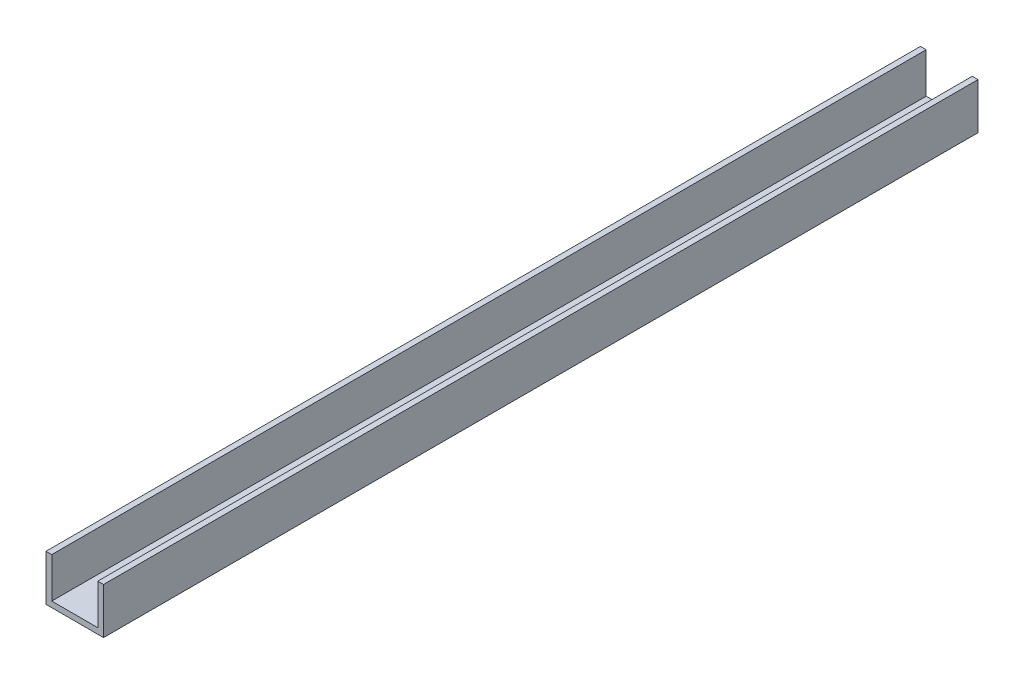
ISO-10303-21;
HEADER;
FILE_DESCRIPTION(('STEP AP214'),'2;1');
FILE_NAME('part.step','',(''),(''),'','','');
FILE_SCHEMA(('AUTOMOTIVE_DESIGN { 1 0 10303 214 1 1 1 1 }'));
ENDSEC;
DATA;
#1=APPLICATION_CONTEXT('core data for automotive mechanical design processes');
#2=APPLICATION_PROTOCOL_DEFINITION('international standard','automotive_design',2000,#1);
#3=PRODUCT_CONTEXT('',#1,'mechanical');
#4=PRODUCT('Part','Part','',(#3));
#5=PRODUCT_RELATED_PRODUCT_CATEGORY('part','',(#4));
#6=PRODUCT_DEFINITION_FORMATION('','',#4);
#7=PRODUCT_DEFINITION_CONTEXT('part definition',#1,'design');
#8=PRODUCT_DEFINITION('design','',#6,#7);
#9=PRODUCT_DEFINITION_SHAPE('','',#8);
#10=(LENGTH_UNIT() NAMED_UNIT(*) SI_UNIT(.MILLI.,.METRE.));
#11=(NAMED_UNIT(*) PLANE_ANGLE_UNIT() SI_UNIT($,.RADIAN.));
#12=(NAMED_UNIT(*) SI_UNIT($,.STERADIAN.) SOLID_ANGLE_UNIT());
#13=UNCERTAINTY_MEASURE_WITH_UNIT(LENGTH_MEASURE(1.E-05),#10,'distance_accuracy_value','');
#14=(GEOMETRIC_REPRESENTATION_CONTEXT(3) GLOBAL_UNCERTAINTY_ASSIGNED_CONTEXT((#13)) GLOBAL_UNIT_ASSIGNED_CONTEXT((#10,
#11,#12)) REPRESENTATION_CONTEXT('',''));
#15=CARTESIAN_POINT('',(0.,0.,0.));
#16=DIRECTION('',(0.,0.,1.));
#17=DIRECTION('',(1.,0.,0.));
#18=AXIS2_PLACEMENT_3D('',#15,#16,#17);
#19=CARTESIAN_POINT('',(0.,0.,241.3));
#20=DIRECTION('',(0.,1.,0.));
#21=DIRECTION('',(0.,0.,1.));
#22=AXIS2_PLACEMENT_3D('',#19,#20,#21);
#23=PLANE('',#22);
#24=DIRECTION('',(1.,0.,0.));
#25=VECTOR('',#24,1.);
#26=CARTESIAN_POINT('',(0.,0.,0.));
#27=LINE('',#26,#25);
#28=CARTESIAN_POINT('',(-7.9375,0.,0.));
#29=VERTEX_POINT('',#28);
#30=CARTESIAN_POINT('',(7.9375,0.,0.));
#31=VERTEX_POINT('',#30);
#32=EDGE_CURVE('E95',#29,#31,#27,.T.);
#33=ORIENTED_EDGE('',*,*,#32,.T.);
#34=DIRECTION('',(0.,0.,-1.));
#35=VECTOR('',#34,1.);
#36=CARTESIAN_POINT('',(7.9375,0.,241.3));
#37=LINE('',#36,#35);
#38=CARTESIAN_POINT('',(7.9375,0.,241.3));
#39=VERTEX_POINT('',#38);
#40=EDGE_CURVE('E11',#39,#31,#37,.T.);
#41=ORIENTED_EDGE('',*,*,#40,.F.);
#42=DIRECTION('',(1.,0.,0.));
#43=VECTOR('',#42,1.);
#44=CARTESIAN_POINT('',(-7.9375,0.,241.3));
#45=LINE('',#44,#43);
#46=CARTESIAN_POINT('',(-7.9375,0.,241.3));
#47=VERTEX_POINT('',#46);
#48=EDGE_CURVE('E101',#47,#39,#45,.T.);
#49=ORIENTED_EDGE('',*,*,#48,.F.);
#50=DIRECTION('',(0.,0.,-1.));
#51=VECTOR('',#50,1.);
#52=CARTESIAN_POINT('',(-7.9375,0.,241.3));
#53=LINE('',#52,#51);
#54=EDGE_CURVE('E135',#47,#29,#53,.T.);
#55=ORIENTED_EDGE('',*,*,#54,.T.);
#56=EDGE_LOOP('',(#33,#41,#49,#55));
#57=FACE_BOUND('',#56,.T.);
#58=ADVANCED_FACE('F43',(#57),#23,.F.);
#59=CARTESIAN_POINT('',(7.9375,0.,241.3));
#60=DIRECTION('',(-1.,0.,0.));
#61=DIRECTION('',(0.,0.,1.));
#62=AXIS2_PLACEMENT_3D('',#59,#60,#61);
#63=PLANE('',#62);
#64=DIRECTION('',(0.,1.,0.));
#65=VECTOR('',#64,1.);
#66=CARTESIAN_POINT('',(7.9375,0.,0.));
#67=LINE('',#66,#65);
#68=CARTESIAN_POINT('',(7.9375,12.7,0.));
#69=VERTEX_POINT('',#68);
#70=EDGE_CURVE('E140',#31,#69,#67,.T.);
#71=ORIENTED_EDGE('',*,*,#70,.T.);
#72=DIRECTION('',(0.,0.,-1.));
#73=VECTOR('',#72,1.);
#74=CARTESIAN_POINT('',(7.9375,12.7,241.3));
#75=LINE('',#74,#73);
#76=CARTESIAN_POINT('',(7.9375,12.7,241.3));
#77=VERTEX_POINT('',#76);
#78=EDGE_CURVE('E51',#77,#69,#75,.T.);
#79=ORIENTED_EDGE('',*,*,#78,.F.);
#80=DIRECTION('',(0.,1.,0.));
#81=VECTOR('',#80,1.);
#82=CARTESIAN_POINT('',(7.9375,0.,241.3));
#83=LINE('',#82,#81);
#84=EDGE_CURVE('E186',#39,#77,#83,.T.);
#85=ORIENTED_EDGE('',*,*,#84,.F.);
#86=ORIENTED_EDGE('',*,*,#40,.T.);
#87=EDGE_LOOP('',(#71,#79,#85,#86));
#88=FACE_BOUND('',#87,.T.);
#89=ADVANCED_FACE('F188',(#88),#63,.F.);
#90=CARTESIAN_POINT('',(7.9375,12.7,241.3));
#91=DIRECTION('',(0.,-1.,0.));
#92=DIRECTION('',(0.,0.,-1.));
#93=AXIS2_PLACEMENT_3D('',#90,#91,#92);
#94=PLANE('',#93);
#95=DIRECTION('',(-1.,0.,0.));
#96=VECTOR('',#95,1.);
#97=CARTESIAN_POINT('',(7.9375,12.7,0.));
#98=LINE('',#97,#96);
#99=CARTESIAN_POINT('',(6.35,12.7,0.));
#100=VERTEX_POINT('',#99);
#101=EDGE_CURVE('E142',#69,#100,#98,.T.);
#102=ORIENTED_EDGE('',*,*,#101,.T.);
#103=DIRECTION('',(0.,0.,-1.));
#104=VECTOR('',#103,1.);
#105=CARTESIAN_POINT('',(6.35,12.7,241.3));
#106=LINE('',#105,#104);
#107=CARTESIAN_POINT('',(6.35,12.7,241.3));
#108=VERTEX_POINT('',#107);
#109=EDGE_CURVE('E159',#108,#100,#106,.T.);
#110=ORIENTED_EDGE('',*,*,#109,.F.);
#111=DIRECTION('',(-1.,0.,0.));
#112=VECTOR('',#111,1.);
#113=CARTESIAN_POINT('',(7.9375,12.7,241.3));
#114=LINE('',#113,#112);
#115=EDGE_CURVE('E170',#77,#108,#114,.T.);
#116=ORIENTED_EDGE('',*,*,#115,.F.);
#117=ORIENTED_EDGE('',*,*,#78,.T.);
#118=EDGE_LOOP('',(#102,#110,#116,#117));
#119=FACE_BOUND('',#118,.T.);
#120=ADVANCED_FACE('F168',(#119),#94,.F.);
#121=CARTESIAN_POINT('',(6.35,12.7,241.3));
#122=DIRECTION('',(1.,0.,0.));
#123=DIRECTION('',(0.,1.,0.));
#124=AXIS2_PLACEMENT_3D('',#121,#122,#123);
#125=PLANE('',#124);
#126=DIRECTION('',(0.,-1.,0.));
#127=VECTOR('',#126,1.);
#128=CARTESIAN_POINT('',(6.35,12.7,0.));
#129=LINE('',#128,#127);
#130=CARTESIAN_POINT('',(6.35,1.5875,0.));
#131=VERTEX_POINT('',#130);
#132=EDGE_CURVE('E144',#100,#131,#129,.T.);
#133=ORIENTED_EDGE('',*,*,#132,.T.);
#134=DIRECTION('',(0.,0.,-1.));
#135=VECTOR('',#134,1.);
#136=CARTESIAN_POINT('',(6.35,1.5875,241.3));
#137=LINE('',#136,#135);
#138=CARTESIAN_POINT('',(6.35,1.5875,241.3));
#139=VERTEX_POINT('',#138);
#140=EDGE_CURVE('E156',#139,#131,#137,.T.);
#141=ORIENTED_EDGE('',*,*,#140,.F.);
#142=DIRECTION('',(0.,-1.,0.));
#143=VECTOR('',#142,1.);
#144=CARTESIAN_POINT('',(6.35,12.7,241.3));
#145=LINE('',#144,#143);
#146=EDGE_CURVE('E182',#108,#139,#145,.T.);
#147=ORIENTED_EDGE('',*,*,#146,.F.);
#148=ORIENTED_EDGE('',*,*,#109,.T.);
#149=EDGE_LOOP('',(#133,#141,#147,#148));
#150=FACE_BOUND('',#149,.T.);
#151=ADVANCED_FACE('F178',(#150),#125,.F.);
#152=CARTESIAN_POINT('',(6.35,1.5875,241.3));
#153=DIRECTION('',(0.,-1.,0.));
#154=DIRECTION('',(0.,0.,-1.));
#155=AXIS2_PLACEMENT_3D('',#152,#153,#154);
#156=PLANE('',#155);
#157=DIRECTION('',(-1.,0.,0.));
#158=VECTOR('',#157,1.);
#159=CARTESIAN_POINT('',(6.35,1.5875,0.));
#160=LINE('',#159,#158);
#161=CARTESIAN_POINT('',(-6.35,1.5875,0.));
#162=VERTEX_POINT('',#161);
#163=EDGE_CURVE('E146',#131,#162,#160,.T.);
#164=ORIENTED_EDGE('',*,*,#163,.T.);
#165=DIRECTION('',(0.,0.,-1.));
#166=VECTOR('',#165,1.);
#167=CARTESIAN_POINT('',(-6.35,1.5875,241.3));
#168=LINE('',#167,#166);
#169=CARTESIAN_POINT('',(-6.35,1.5875,241.3));
#170=VERTEX_POINT('',#169);
#171=EDGE_CURVE('E130',#170,#162,#168,.T.);
#172=ORIENTED_EDGE('',*,*,#171,.F.);
#173=DIRECTION('',(-1.,0.,0.));
#174=VECTOR('',#173,1.);
#175=CARTESIAN_POINT('',(6.35,1.5875,241.3));
#176=LINE('',#175,#174);
#177=EDGE_CURVE('E121',#139,#170,#176,.T.);
#178=ORIENTED_EDGE('',*,*,#177,.F.);
#179=ORIENTED_EDGE('',*,*,#140,.T.);
#180=EDGE_LOOP('',(#164,#172,#178,#179));
#181=FACE_BOUND('',#180,.T.);
#182=ADVANCED_FACE('F181',(#181),#156,.F.);
#183=CARTESIAN_POINT('',(-6.35,1.5875,241.3));
#184=DIRECTION('',(-1.,0.,0.));
#185=DIRECTION('',(0.,0.,1.));
#186=AXIS2_PLACEMENT_3D('',#183,#184,#185);
#187=PLANE('',#186);
#188=DIRECTION('',(0.,1.,0.));
#189=VECTOR('',#188,1.);
#190=CARTESIAN_POINT('',(-6.35,1.5875,0.));
#191=LINE('',#190,#189);
#192=CARTESIAN_POINT('',(-6.35,12.7,0.));
#193=VERTEX_POINT('',#192);
#194=EDGE_CURVE('E129',#162,#193,#191,.T.);
#195=ORIENTED_EDGE('',*,*,#194,.T.);
#196=DIRECTION('',(0.,0.,-1.));
#197=VECTOR('',#196,1.);
#198=CARTESIAN_POINT('',(-6.35,12.7,241.3));
#199=LINE('',#198,#197);
#200=CARTESIAN_POINT('',(-6.35,12.7,241.3));
#201=VERTEX_POINT('',#200);
#202=EDGE_CURVE('E126',#201,#193,#199,.T.);
#203=ORIENTED_EDGE('',*,*,#202,.F.);
#204=DIRECTION('',(0.,1.,0.));
#205=VECTOR('',#204,1.);
#206=CARTESIAN_POINT('',(-6.35,1.5875,241.3));
#207=LINE('',#206,#205);
#208=EDGE_CURVE('E115',#170,#201,#207,.T.);
#209=ORIENTED_EDGE('',*,*,#208,.F.);
#210=ORIENTED_EDGE('',*,*,#171,.T.);
#211=EDGE_LOOP('',(#195,#203,#209,#210));
#212=FACE_BOUND('',#211,.T.);
#213=ADVANCED_FACE('F127',(#212),#187,.F.);
#214=CARTESIAN_POINT('',(-6.35,12.7,241.3));
#215=DIRECTION('',(0.,-1.,0.));
#216=DIRECTION('',(0.,0.,-1.));
#217=AXIS2_PLACEMENT_3D('',#214,#215,#216);
#218=PLANE('',#217);
#219=DIRECTION('',(-1.,0.,0.));
#220=VECTOR('',#219,1.);
#221=CARTESIAN_POINT('',(-6.35,12.7,0.));
#222=LINE('',#221,#220);
#223=CARTESIAN_POINT('',(-7.9375,12.7,0.));
#224=VERTEX_POINT('',#223);
#225=EDGE_CURVE('E88',#193,#224,#222,.T.);
#226=ORIENTED_EDGE('',*,*,#225,.T.);
#227=DIRECTION('',(0.,0.,-1.));
#228=VECTOR('',#227,1.);
#229=CARTESIAN_POINT('',(-7.9375,12.7,241.3));
#230=LINE('',#229,#228);
#231=CARTESIAN_POINT('',(-7.9375,12.7,241.3));
#232=VERTEX_POINT('',#231);
#233=EDGE_CURVE('E131',#232,#224,#230,.T.);
#234=ORIENTED_EDGE('',*,*,#233,.F.);
#235=DIRECTION('',(-1.,0.,0.));
#236=VECTOR('',#235,1.);
#237=CARTESIAN_POINT('',(-6.35,12.7,241.3));
#238=LINE('',#237,#236);
#239=EDGE_CURVE('E119',#201,#232,#238,.T.);
#240=ORIENTED_EDGE('',*,*,#239,.F.);
#241=ORIENTED_EDGE('',*,*,#202,.T.);
#242=EDGE_LOOP('',(#226,#234,#240,#241));
#243=FACE_BOUND('',#242,.T.);
#244=ADVANCED_FACE('F133',(#243),#218,.F.);
#245=CARTESIAN_POINT('',(-7.9375,12.7,241.3));
#246=DIRECTION('',(1.,0.,0.));
#247=DIRECTION('',(0.,1.,0.));
#248=AXIS2_PLACEMENT_3D('',#245,#246,#247);
#249=PLANE('',#248);
#250=DIRECTION('',(0.,-1.,0.));
#251=VECTOR('',#250,1.);
#252=CARTESIAN_POINT('',(-7.9375,12.7,0.));
#253=LINE('',#252,#251);
#254=EDGE_CURVE('E150',#224,#29,#253,.T.);
#255=ORIENTED_EDGE('',*,*,#254,.T.);
#256=ORIENTED_EDGE('',*,*,#54,.F.);
#257=DIRECTION('',(0.,-1.,0.));
#258=VECTOR('',#257,1.);
#259=CARTESIAN_POINT('',(-7.9375,12.7,241.3));
#260=LINE('',#259,#258);
#261=EDGE_CURVE('E59',#232,#47,#260,.T.);
#262=ORIENTED_EDGE('',*,*,#261,.F.);
#263=ORIENTED_EDGE('',*,*,#233,.T.);
#264=EDGE_LOOP('',(#255,#256,#262,#263));
#265=FACE_BOUND('',#264,.T.);
#266=ADVANCED_FACE('F191',(#265),#249,.F.);
#267=CARTESIAN_POINT('',(0.,0.,241.3));
#268=DIRECTION('',(0.,0.,1.));
#269=DIRECTION('',(1.,0.,0.));
#270=AXIS2_PLACEMENT_3D('',#267,#268,#269);
#271=PLANE('',#270);
#272=ORIENTED_EDGE('',*,*,#48,.T.);
#273=ORIENTED_EDGE('',*,*,#84,.T.);
#274=ORIENTED_EDGE('',*,*,#115,.T.);
#275=ORIENTED_EDGE('',*,*,#146,.T.);
#276=ORIENTED_EDGE('',*,*,#177,.T.);
#277=ORIENTED_EDGE('',*,*,#208,.T.);
#278=ORIENTED_EDGE('',*,*,#239,.T.);
#279=ORIENTED_EDGE('',*,*,#261,.T.);
#280=EDGE_LOOP('',(#272,#273,#274,#275,#276,#277,#278,#279));
#281=FACE_BOUND('',#280,.T.);
#282=ADVANCED_FACE('F117',(#281),#271,.T.);
#283=CARTESIAN_POINT('',(0.,0.,0.));
#284=DIRECTION('',(0.,0.,1.));
#285=DIRECTION('',(1.,0.,0.));
#286=AXIS2_PLACEMENT_3D('',#283,#284,#285);
#287=PLANE('',#286);
#288=ORIENTED_EDGE('',*,*,#32,.F.);
#289=ORIENTED_EDGE('',*,*,#254,.F.);
#290=ORIENTED_EDGE('',*,*,#225,.F.);
#291=ORIENTED_EDGE('',*,*,#194,.F.);
#292=ORIENTED_EDGE('',*,*,#163,.F.);
#293=ORIENTED_EDGE('',*,*,#132,.F.);
#294=ORIENTED_EDGE('',*,*,#101,.F.);
#295=ORIENTED_EDGE('',*,*,#70,.F.);
#296=EDGE_LOOP('',(#288,#289,#290,#291,#292,#293,#294,#295));
#297=FACE_BOUND('',#296,.T.);
#298=ADVANCED_FACE('F174',(#297),#287,.F.);
#299=CLOSED_SHELL('',(#58,#89,#120,#151,#182,#213,#244,#266,#282,#298));
#300=MANIFOLD_SOLID_BREP('B2',#299);
#301=ADVANCED_BREP_SHAPE_REPRESENTATION('',(#18,#300),#14);
#302=SHAPE_DEFINITION_REPRESENTATION(#9,#301);
ENDSEC;
END-ISO-10303-21;
